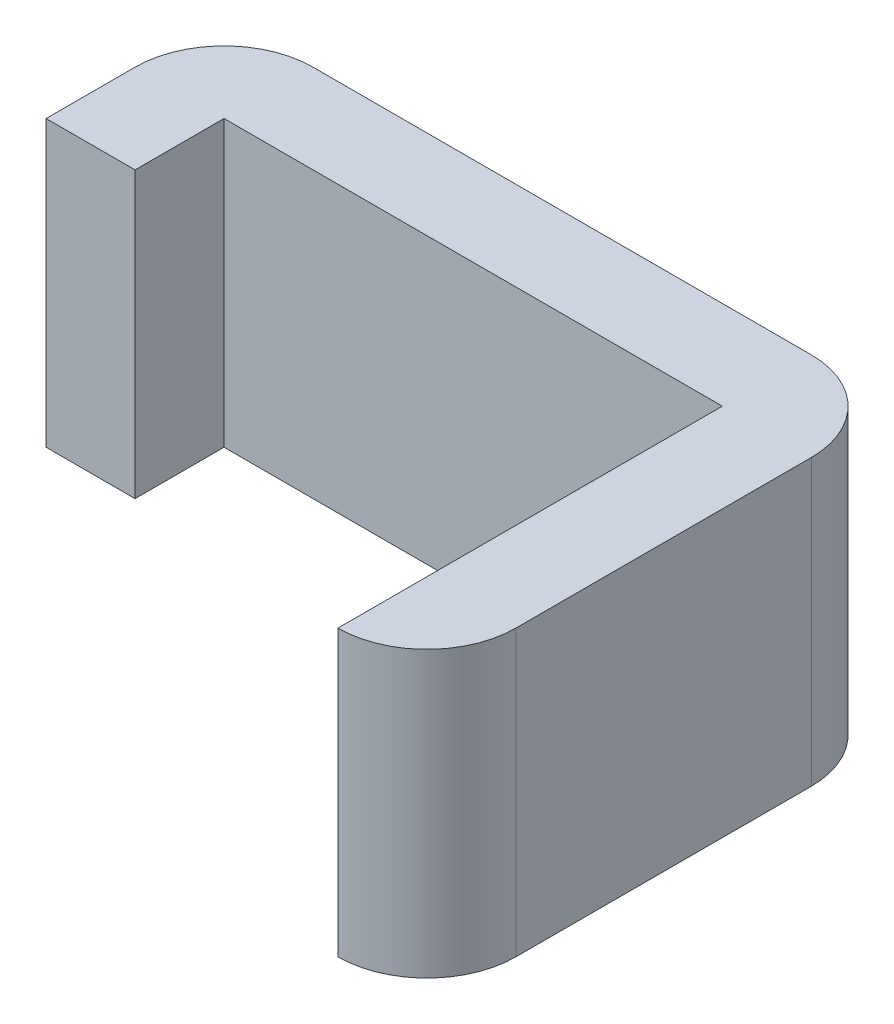
ISO-10303-21;
HEADER;
FILE_DESCRIPTION(('STEP AP214'),'2;1');
FILE_NAME('part.step','',(''),(''),'','','');
FILE_SCHEMA(('AUTOMOTIVE_DESIGN { 1 0 10303 214 1 1 1 1 }'));
ENDSEC;
DATA;
#1=APPLICATION_CONTEXT('core data for automotive mechanical design processes');
#2=APPLICATION_PROTOCOL_DEFINITION('international standard','automotive_design',2000,#1);
#3=PRODUCT_CONTEXT('',#1,'mechanical');
#4=PRODUCT('Part','Part','',(#3));
#5=PRODUCT_RELATED_PRODUCT_CATEGORY('part','',(#4));
#6=PRODUCT_DEFINITION_FORMATION('','',#4);
#7=PRODUCT_DEFINITION_CONTEXT('part definition',#1,'design');
#8=PRODUCT_DEFINITION('design','',#6,#7);
#9=PRODUCT_DEFINITION_SHAPE('','',#8);
#10=(LENGTH_UNIT() NAMED_UNIT(*) SI_UNIT(.MILLI.,.METRE.));
#11=(NAMED_UNIT(*) PLANE_ANGLE_UNIT() SI_UNIT($,.RADIAN.));
#12=(NAMED_UNIT(*) SI_UNIT($,.STERADIAN.) SOLID_ANGLE_UNIT());
#13=UNCERTAINTY_MEASURE_WITH_UNIT(LENGTH_MEASURE(1.E-05),#10,'distance_accuracy_value','');
#14=(GEOMETRIC_REPRESENTATION_CONTEXT(3) GLOBAL_UNCERTAINTY_ASSIGNED_CONTEXT((#13)) GLOBAL_UNIT_ASSIGNED_CONTEXT((#10,
#11,#12)) REPRESENTATION_CONTEXT('',''));
#15=CARTESIAN_POINT('',(0.,0.,0.));
#16=DIRECTION('',(0.,0.,1.));
#17=DIRECTION('',(1.,0.,0.));
#18=AXIS2_PLACEMENT_3D('',#15,#16,#17);
#19=CARTESIAN_POINT('',(-0.7,-0.4,0.25));
#20=DIRECTION('',(0.,0.,-1.));
#21=DIRECTION('',(-1.,0.,0.));
#22=AXIS2_PLACEMENT_3D('',#19,#20,#21);
#23=PLANE('',#22);
#24=DIRECTION('',(0.,1.,0.));
#25=VECTOR('',#24,1.);
#26=CARTESIAN_POINT('',(0.7,-0.4,0.25));
#27=LINE('',#26,#25);
#28=CARTESIAN_POINT('',(0.7,-0.4,0.25));
#29=VERTEX_POINT('',#28);
#30=CARTESIAN_POINT('',(0.7,0.4,0.25));
#31=VERTEX_POINT('',#30);
#32=EDGE_CURVE('E125',#29,#31,#27,.T.);
#33=ORIENTED_EDGE('',*,*,#32,.T.);
#34=DIRECTION('',(1.,0.,0.));
#35=VECTOR('',#34,1.);
#36=CARTESIAN_POINT('',(0.7,0.4,0.25));
#37=LINE('',#36,#35);
#38=CARTESIAN_POINT('',(-0.7,0.4,0.25));
#39=VERTEX_POINT('',#38);
#40=EDGE_CURVE('E112',#31,#39,#37,.F.);
#41=ORIENTED_EDGE('',*,*,#40,.T.);
#42=DIRECTION('',(0.,1.,0.));
#43=VECTOR('',#42,1.);
#44=CARTESIAN_POINT('',(-0.7,-0.4,0.25));
#45=LINE('',#44,#43);
#46=CARTESIAN_POINT('',(-0.7,-0.4,0.25));
#47=VERTEX_POINT('',#46);
#48=EDGE_CURVE('E108',#39,#47,#45,.F.);
#49=ORIENTED_EDGE('',*,*,#48,.T.);
#50=DIRECTION('',(1.,0.,0.));
#51=VECTOR('',#50,1.);
#52=CARTESIAN_POINT('',(0.7,-0.4,0.25));
#53=LINE('',#52,#51);
#54=EDGE_CURVE('E126',#29,#47,#53,.F.);
#55=ORIENTED_EDGE('',*,*,#54,.F.);
#56=EDGE_LOOP('',(#33,#41,#49,#55));
#57=FACE_BOUND('',#56,.T.);
#58=ADVANCED_FACE('F17',(#57),#23,.F.);
#59=CARTESIAN_POINT('',(-0.7,-0.4,0.5));
#60=DIRECTION('',(-1.,0.,0.));
#61=DIRECTION('',(0.,0.,1.));
#62=AXIS2_PLACEMENT_3D('',#59,#60,#61);
#63=PLANE('',#62);
#64=ORIENTED_EDGE('',*,*,#48,.F.);
#65=DIRECTION('',(0.,0.,-1.));
#66=VECTOR('',#65,1.);
#67=CARTESIAN_POINT('',(-0.7,0.4,0.25));
#68=LINE('',#67,#66);
#69=CARTESIAN_POINT('',(-0.7,0.4,0.5));
#70=VERTEX_POINT('',#69);
#71=EDGE_CURVE('E120',#39,#70,#68,.F.);
#72=ORIENTED_EDGE('',*,*,#71,.T.);
#73=DIRECTION('',(0.,1.,0.));
#74=VECTOR('',#73,1.);
#75=CARTESIAN_POINT('',(-0.7,-0.4,0.5));
#76=LINE('',#75,#74);
#77=CARTESIAN_POINT('',(-0.7,-0.4,0.5));
#78=VERTEX_POINT('',#77);
#79=EDGE_CURVE('E177',#70,#78,#76,.F.);
#80=ORIENTED_EDGE('',*,*,#79,.T.);
#81=DIRECTION('',(0.,0.,-1.));
#82=VECTOR('',#81,1.);
#83=CARTESIAN_POINT('',(-0.7,-0.4,0.25));
#84=LINE('',#83,#82);
#85=EDGE_CURVE('E168',#47,#78,#84,.F.);
#86=ORIENTED_EDGE('',*,*,#85,.F.);
#87=EDGE_LOOP('',(#64,#72,#80,#86));
#88=FACE_BOUND('',#87,.T.);
#89=ADVANCED_FACE('F227',(#88),#63,.F.);
#90=CARTESIAN_POINT('',(-0.95,-0.4,0.5));
#91=DIRECTION('',(0.,0.,-1.));
#92=DIRECTION('',(-1.,0.,0.));
#93=AXIS2_PLACEMENT_3D('',#90,#91,#92);
#94=PLANE('',#93);
#95=ORIENTED_EDGE('',*,*,#79,.F.);
#96=DIRECTION('',(1.,0.,0.));
#97=VECTOR('',#96,1.);
#98=CARTESIAN_POINT('',(0.7,0.4,0.5));
#99=LINE('',#98,#97);
#100=CARTESIAN_POINT('',(-0.95,0.4,0.5));
#101=VERTEX_POINT('',#100);
#102=EDGE_CURVE('E145',#70,#101,#99,.F.);
#103=ORIENTED_EDGE('',*,*,#102,.T.);
#104=DIRECTION('',(0.,1.,0.));
#105=VECTOR('',#104,1.);
#106=CARTESIAN_POINT('',(-0.95,-0.4,0.5));
#107=LINE('',#106,#105);
#108=CARTESIAN_POINT('',(-0.95,-0.4,0.5));
#109=VERTEX_POINT('',#108);
#110=EDGE_CURVE('E184',#101,#109,#107,.F.);
#111=ORIENTED_EDGE('',*,*,#110,.T.);
#112=DIRECTION('',(1.,0.,0.));
#113=VECTOR('',#112,1.);
#114=CARTESIAN_POINT('',(0.7,-0.4,0.5));
#115=LINE('',#114,#113);
#116=EDGE_CURVE('E86',#78,#109,#115,.F.);
#117=ORIENTED_EDGE('',*,*,#116,.F.);
#118=EDGE_LOOP('',(#95,#103,#111,#117));
#119=FACE_BOUND('',#118,.T.);
#120=ADVANCED_FACE('F226',(#119),#94,.F.);
#121=CARTESIAN_POINT('',(-0.95,-0.4,0.25));
#122=DIRECTION('',(1.,0.,0.));
#123=DIRECTION('',(0.,0.,-1.));
#124=AXIS2_PLACEMENT_3D('',#121,#122,#123);
#125=PLANE('',#124);
#126=ORIENTED_EDGE('',*,*,#110,.F.);
#127=DIRECTION('',(0.,0.,-1.));
#128=VECTOR('',#127,1.);
#129=CARTESIAN_POINT('',(-0.95,0.4,0.25));
#130=LINE('',#129,#128);
#131=CARTESIAN_POINT('',(-0.95,0.4,0.25));
#132=VERTEX_POINT('',#131);
#133=EDGE_CURVE('E148',#101,#132,#130,.T.);
#134=ORIENTED_EDGE('',*,*,#133,.T.);
#135=DIRECTION('',(0.,-1.,0.));
#136=VECTOR('',#135,1.);
#137=CARTESIAN_POINT('',(-0.95,-0.4,0.25));
#138=LINE('',#137,#136);
#139=CARTESIAN_POINT('',(-0.95,-0.4,0.25));
#140=VERTEX_POINT('',#139);
#141=EDGE_CURVE('E134',#140,#132,#138,.F.);
#142=ORIENTED_EDGE('',*,*,#141,.F.);
#143=DIRECTION('',(0.,0.,-1.));
#144=VECTOR('',#143,1.);
#145=CARTESIAN_POINT('',(-0.95,-0.4,0.25));
#146=LINE('',#145,#144);
#147=EDGE_CURVE('E80',#109,#140,#146,.T.);
#148=ORIENTED_EDGE('',*,*,#147,.F.);
#149=EDGE_LOOP('',(#126,#134,#142,#148));
#150=FACE_BOUND('',#149,.T.);
#151=ADVANCED_FACE('F224',(#150),#125,.F.);
#152=CARTESIAN_POINT('',(0.95,-0.4,1.08));
#153=DIRECTION('',(-1.,0.,0.));
#154=DIRECTION('',(0.,0.,1.));
#155=AXIS2_PLACEMENT_3D('',#152,#153,#154);
#156=PLANE('',#155);
#157=DIRECTION('',(0.,-1.,0.));
#158=VECTOR('',#157,1.);
#159=CARTESIAN_POINT('',(0.95,-0.4,0.25));
#160=LINE('',#159,#158);
#161=CARTESIAN_POINT('',(0.95,0.4,0.25));
#162=VERTEX_POINT('',#161);
#163=CARTESIAN_POINT('',(0.95,-0.4,0.25));
#164=VERTEX_POINT('',#163);
#165=EDGE_CURVE('E74',#162,#164,#160,.T.);
#166=ORIENTED_EDGE('',*,*,#165,.F.);
#167=DIRECTION('',(0.,0.,-1.));
#168=VECTOR('',#167,1.);
#169=CARTESIAN_POINT('',(0.95,0.4,0.25));
#170=LINE('',#169,#168);
#171=CARTESIAN_POINT('',(0.95,0.4,1.08));
#172=VERTEX_POINT('',#171);
#173=EDGE_CURVE('E139',#162,#172,#170,.F.);
#174=ORIENTED_EDGE('',*,*,#173,.T.);
#175=DIRECTION('',(0.,-1.,0.));
#176=VECTOR('',#175,1.);
#177=CARTESIAN_POINT('',(0.95,-0.4,1.08));
#178=LINE('',#177,#176);
#179=CARTESIAN_POINT('',(0.95,-0.4,1.08));
#180=VERTEX_POINT('',#179);
#181=EDGE_CURVE('E190',#180,#172,#178,.F.);
#182=ORIENTED_EDGE('',*,*,#181,.F.);
#183=DIRECTION('',(0.,0.,-1.));
#184=VECTOR('',#183,1.);
#185=CARTESIAN_POINT('',(0.95,-0.4,0.25));
#186=LINE('',#185,#184);
#187=EDGE_CURVE('E160',#164,#180,#186,.F.);
#188=ORIENTED_EDGE('',*,*,#187,.F.);
#189=EDGE_LOOP('',(#166,#174,#182,#188));
#190=FACE_BOUND('',#189,.T.);
#191=ADVANCED_FACE('F216',(#190),#156,.F.);
#192=CARTESIAN_POINT('',(0.7,-0.4,1.08));
#193=DIRECTION('',(0.,-1.,0.));
#194=DIRECTION('',(0.,0.,-1.));
#195=AXIS2_PLACEMENT_3D('',#192,#193,#194);
#196=CYLINDRICAL_SURFACE('',#195,0.25);
#197=CARTESIAN_POINT('',(0.7,0.4,1.08));
#198=DIRECTION('',(0.,-1.,0.));
#199=DIRECTION('',(0.,0.,-1.));
#200=AXIS2_PLACEMENT_3D('',#197,#198,#199);
#201=CIRCLE('',#200,0.25);
#202=CARTESIAN_POINT('',(0.7,0.4,1.33));
#203=VERTEX_POINT('',#202);
#204=EDGE_CURVE('E135',#172,#203,#201,.T.);
#205=ORIENTED_EDGE('',*,*,#204,.T.);
#206=DIRECTION('',(0.,1.,0.));
#207=VECTOR('',#206,1.);
#208=CARTESIAN_POINT('',(0.7,-0.4,1.33));
#209=LINE('',#208,#207);
#210=CARTESIAN_POINT('',(0.7,-0.4,1.33));
#211=VERTEX_POINT('',#210);
#212=EDGE_CURVE('E129',#203,#211,#209,.F.);
#213=ORIENTED_EDGE('',*,*,#212,.T.);
#214=CARTESIAN_POINT('',(0.7,-0.4,1.08));
#215=DIRECTION('',(0.,-1.,0.));
#216=DIRECTION('',(0.,0.,-1.));
#217=AXIS2_PLACEMENT_3D('',#214,#215,#216);
#218=CIRCLE('',#217,0.25);
#219=EDGE_CURVE('E156',#180,#211,#218,.T.);
#220=ORIENTED_EDGE('',*,*,#219,.F.);
#221=ORIENTED_EDGE('',*,*,#181,.T.);
#222=EDGE_LOOP('',(#205,#213,#220,#221));
#223=FACE_BOUND('',#222,.T.);
#224=ADVANCED_FACE('F218',(#223),#196,.T.);
#225=CARTESIAN_POINT('',(0.7,-0.4,0.25));
#226=DIRECTION('',(1.,0.,0.));
#227=DIRECTION('',(0.,0.,-1.));
#228=AXIS2_PLACEMENT_3D('',#225,#226,#227);
#229=PLANE('',#228);
#230=DIRECTION('',(0.,0.,-1.));
#231=VECTOR('',#230,1.);
#232=CARTESIAN_POINT('',(0.7,-0.4,0.25));
#233=LINE('',#232,#231);
#234=EDGE_CURVE('E159',#211,#29,#233,.T.);
#235=ORIENTED_EDGE('',*,*,#234,.F.);
#236=ORIENTED_EDGE('',*,*,#212,.F.);
#237=DIRECTION('',(0.,0.,-1.));
#238=VECTOR('',#237,1.);
#239=CARTESIAN_POINT('',(0.7,0.4,0.25));
#240=LINE('',#239,#238);
#241=EDGE_CURVE('E117',#203,#31,#240,.T.);
#242=ORIENTED_EDGE('',*,*,#241,.T.);
#243=ORIENTED_EDGE('',*,*,#32,.F.);
#244=EDGE_LOOP('',(#235,#236,#242,#243));
#245=FACE_BOUND('',#244,.T.);
#246=ADVANCED_FACE('F131',(#245),#229,.F.);
#247=CARTESIAN_POINT('',(0.7,-0.4,0.25));
#248=DIRECTION('',(0.,-1.,0.));
#249=DIRECTION('',(0.,0.,-1.));
#250=AXIS2_PLACEMENT_3D('',#247,#248,#249);
#251=CYLINDRICAL_SURFACE('',#250,0.25);
#252=CARTESIAN_POINT('',(0.7,0.4,0.25));
#253=DIRECTION('',(0.,-1.,0.));
#254=DIRECTION('',(0.,0.,-1.));
#255=AXIS2_PLACEMENT_3D('',#252,#253,#254);
#256=CIRCLE('',#255,0.25);
#257=CARTESIAN_POINT('',(0.7,0.4,0.));
#258=VERTEX_POINT('',#257);
#259=EDGE_CURVE('E20',#258,#162,#256,.T.);
#260=ORIENTED_EDGE('',*,*,#259,.T.);
#261=ORIENTED_EDGE('',*,*,#165,.T.);
#262=CARTESIAN_POINT('',(0.7,-0.4,0.25));
#263=DIRECTION('',(0.,-1.,0.));
#264=DIRECTION('',(0.,0.,-1.));
#265=AXIS2_PLACEMENT_3D('',#262,#263,#264);
#266=CIRCLE('',#265,0.25);
#267=CARTESIAN_POINT('',(0.7,-0.4,0.));
#268=VERTEX_POINT('',#267);
#269=EDGE_CURVE('E161',#268,#164,#266,.T.);
#270=ORIENTED_EDGE('',*,*,#269,.F.);
#271=DIRECTION('',(0.,1.,0.));
#272=VECTOR('',#271,1.);
#273=CARTESIAN_POINT('',(0.7,-0.4,0.));
#274=LINE('',#273,#272);
#275=EDGE_CURVE('E64',#268,#258,#274,.T.);
#276=ORIENTED_EDGE('',*,*,#275,.T.);
#277=EDGE_LOOP('',(#260,#261,#270,#276));
#278=FACE_BOUND('',#277,.T.);
#279=ADVANCED_FACE('F219',(#278),#251,.T.);
#280=CARTESIAN_POINT('',(0.7,0.4,0.25));
#281=DIRECTION('',(0.,-1.,0.));
#282=DIRECTION('',(0.,0.,-1.));
#283=AXIS2_PLACEMENT_3D('',#280,#281,#282);
#284=PLANE('',#283);
#285=ORIENTED_EDGE('',*,*,#241,.F.);
#286=ORIENTED_EDGE('',*,*,#204,.F.);
#287=ORIENTED_EDGE('',*,*,#173,.F.);
#288=ORIENTED_EDGE('',*,*,#259,.F.);
#289=DIRECTION('',(1.,0.,0.));
#290=VECTOR('',#289,1.);
#291=CARTESIAN_POINT('',(0.7,0.4,0.));
#292=LINE('',#291,#290);
#293=CARTESIAN_POINT('',(-0.7,0.4,0.));
#294=VERTEX_POINT('',#293);
#295=EDGE_CURVE('E204',#258,#294,#292,.F.);
#296=ORIENTED_EDGE('',*,*,#295,.T.);
#297=CARTESIAN_POINT('',(-0.7,0.4,0.25));
#298=DIRECTION('',(0.,-1.,0.));
#299=DIRECTION('',(0.,0.,-1.));
#300=AXIS2_PLACEMENT_3D('',#297,#298,#299);
#301=CIRCLE('',#300,0.25);
#302=EDGE_CURVE('E137',#132,#294,#301,.T.);
#303=ORIENTED_EDGE('',*,*,#302,.F.);
#304=ORIENTED_EDGE('',*,*,#133,.F.);
#305=ORIENTED_EDGE('',*,*,#102,.F.);
#306=ORIENTED_EDGE('',*,*,#71,.F.);
#307=ORIENTED_EDGE('',*,*,#40,.F.);
#308=EDGE_LOOP('',(#285,#286,#287,#288,#296,#303,#304,#305,#306,#307));
#309=FACE_BOUND('',#308,.T.);
#310=ADVANCED_FACE('F114',(#309),#284,.F.);
#311=CARTESIAN_POINT('',(-0.7,-0.4,0.25));
#312=DIRECTION('',(0.,-1.,0.));
#313=DIRECTION('',(0.,0.,-1.));
#314=AXIS2_PLACEMENT_3D('',#311,#312,#313);
#315=CYLINDRICAL_SURFACE('',#314,0.25);
#316=ORIENTED_EDGE('',*,*,#302,.T.);
#317=DIRECTION('',(0.,1.,0.));
#318=VECTOR('',#317,1.);
#319=CARTESIAN_POINT('',(-0.7,-0.4,0.));
#320=LINE('',#319,#318);
#321=CARTESIAN_POINT('',(-0.7,-0.4,0.));
#322=VERTEX_POINT('',#321);
#323=EDGE_CURVE('E26',#294,#322,#320,.F.);
#324=ORIENTED_EDGE('',*,*,#323,.T.);
#325=CARTESIAN_POINT('',(-0.7,-0.4,0.25));
#326=DIRECTION('',(0.,-1.,0.));
#327=DIRECTION('',(0.,0.,-1.));
#328=AXIS2_PLACEMENT_3D('',#325,#326,#327);
#329=CIRCLE('',#328,0.25);
#330=EDGE_CURVE('E34',#140,#322,#329,.T.);
#331=ORIENTED_EDGE('',*,*,#330,.F.);
#332=ORIENTED_EDGE('',*,*,#141,.T.);
#333=EDGE_LOOP('',(#316,#324,#331,#332));
#334=FACE_BOUND('',#333,.T.);
#335=ADVANCED_FACE('F221',(#334),#315,.T.);
#336=CARTESIAN_POINT('',(0.7,-0.4,0.25));
#337=DIRECTION('',(0.,-1.,0.));
#338=DIRECTION('',(0.,0.,-1.));
#339=AXIS2_PLACEMENT_3D('',#336,#337,#338);
#340=PLANE('',#339);
#341=ORIENTED_EDGE('',*,*,#219,.T.);
#342=ORIENTED_EDGE('',*,*,#234,.T.);
#343=ORIENTED_EDGE('',*,*,#54,.T.);
#344=ORIENTED_EDGE('',*,*,#85,.T.);
#345=ORIENTED_EDGE('',*,*,#116,.T.);
#346=ORIENTED_EDGE('',*,*,#147,.T.);
#347=ORIENTED_EDGE('',*,*,#330,.T.);
#348=DIRECTION('',(1.,0.,0.));
#349=VECTOR('',#348,1.);
#350=CARTESIAN_POINT('',(0.7,-0.4,0.));
#351=LINE('',#350,#349);
#352=EDGE_CURVE('E11',#322,#268,#351,.T.);
#353=ORIENTED_EDGE('',*,*,#352,.T.);
#354=ORIENTED_EDGE('',*,*,#269,.T.);
#355=ORIENTED_EDGE('',*,*,#187,.T.);
#356=EDGE_LOOP('',(#341,#342,#343,#344,#345,#346,#347,#353,#354,#355));
#357=FACE_BOUND('',#356,.T.);
#358=ADVANCED_FACE('F213',(#357),#340,.T.);
#359=CARTESIAN_POINT('',(0.7,-0.4,0.));
#360=DIRECTION('',(0.,0.,1.));
#361=DIRECTION('',(1.,0.,0.));
#362=AXIS2_PLACEMENT_3D('',#359,#360,#361);
#363=PLANE('',#362);
#364=ORIENTED_EDGE('',*,*,#323,.F.);
#365=ORIENTED_EDGE('',*,*,#295,.F.);
#366=ORIENTED_EDGE('',*,*,#275,.F.);
#367=ORIENTED_EDGE('',*,*,#352,.F.);
#368=EDGE_LOOP('',(#364,#365,#366,#367));
#369=FACE_BOUND('',#368,.T.);
#370=ADVANCED_FACE('F220',(#369),#363,.F.);
#371=CLOSED_SHELL('',(#58,#89,#120,#151,#191,#224,#246,#279,#310,#335,#358,#370));
#372=MANIFOLD_SOLID_BREP('B1',#371);
#373=ADVANCED_BREP_SHAPE_REPRESENTATION('',(#18,#372),#14);
#374=SHAPE_DEFINITION_REPRESENTATION(#9,#373);
ENDSEC;
END-ISO-10303-21;
